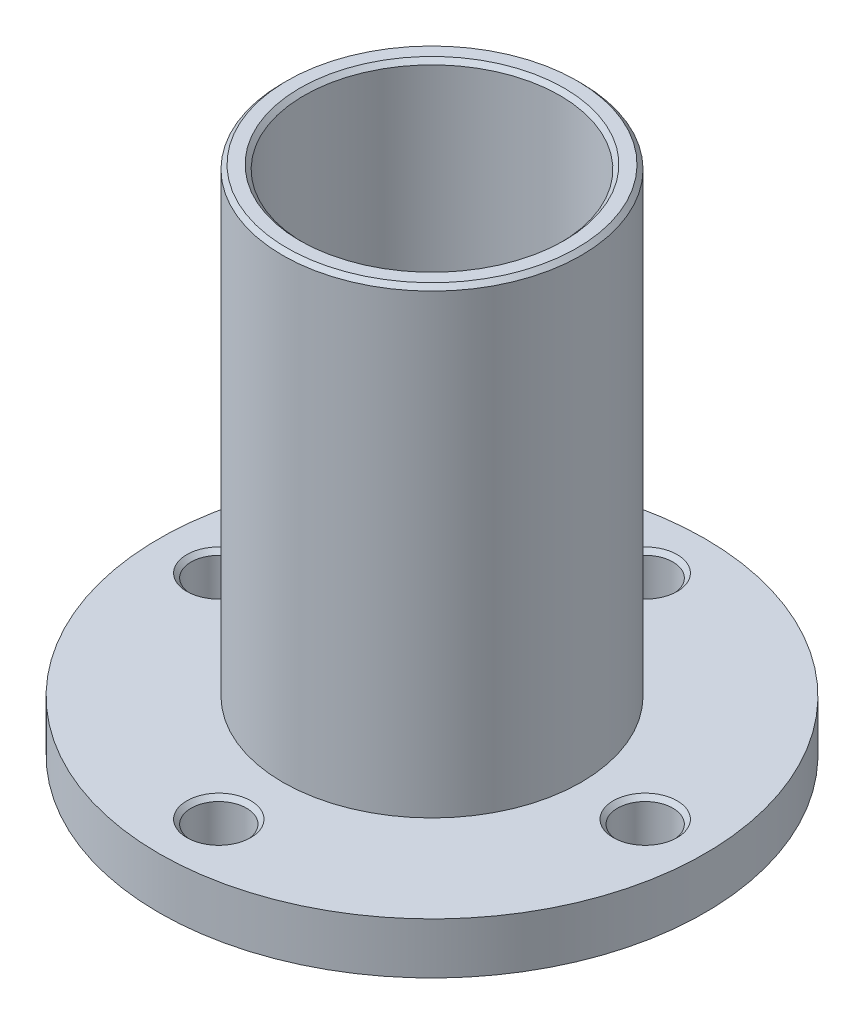
ISO-10303-21;
HEADER;
FILE_DESCRIPTION(('STEP AP214'),'2;1');
FILE_NAME('part.step','',(''),(''),'','','');
FILE_SCHEMA(('AUTOMOTIVE_DESIGN { 1 0 10303 214 1 1 1 1 }'));
ENDSEC;
DATA;
#1=APPLICATION_CONTEXT('core data for automotive mechanical design processes');
#2=APPLICATION_PROTOCOL_DEFINITION('international standard','automotive_design',2000,#1);
#3=PRODUCT_CONTEXT('',#1,'mechanical');
#4=PRODUCT('Part','Part','',(#3));
#5=PRODUCT_RELATED_PRODUCT_CATEGORY('part','',(#4));
#6=PRODUCT_DEFINITION_FORMATION('','',#4);
#7=PRODUCT_DEFINITION_CONTEXT('part definition',#1,'design');
#8=PRODUCT_DEFINITION('design','',#6,#7);
#9=PRODUCT_DEFINITION_SHAPE('','',#8);
#10=(LENGTH_UNIT() NAMED_UNIT(*) SI_UNIT(.MILLI.,.METRE.));
#11=(NAMED_UNIT(*) PLANE_ANGLE_UNIT() SI_UNIT($,.RADIAN.));
#12=(NAMED_UNIT(*) SI_UNIT($,.STERADIAN.) SOLID_ANGLE_UNIT());
#13=UNCERTAINTY_MEASURE_WITH_UNIT(LENGTH_MEASURE(1.E-05),#10,'distance_accuracy_value','');
#14=(GEOMETRIC_REPRESENTATION_CONTEXT(3) GLOBAL_UNCERTAINTY_ASSIGNED_CONTEXT((#13)) GLOBAL_UNIT_ASSIGNED_CONTEXT((#10,
#11,#12)) REPRESENTATION_CONTEXT('',''));
#15=CARTESIAN_POINT('',(0.,0.,0.));
#16=DIRECTION('',(0.,0.,1.));
#17=DIRECTION('',(1.,0.,0.));
#18=AXIS2_PLACEMENT_3D('',#15,#16,#17);
#19=CARTESIAN_POINT('',(-15.,60.,0.));
#20=DIRECTION('',(0.,-1.,0.));
#21=DIRECTION('',(0.,0.,-1.));
#22=AXIS2_PLACEMENT_3D('',#19,#20,#21);
#23=PLANE('',#22);
#24=CARTESIAN_POINT('',(0.,60.,0.));
#25=DIRECTION('',(0.,-1.,0.));
#26=DIRECTION('',(0.,0.,-1.));
#27=AXIS2_PLACEMENT_3D('',#24,#25,#26);
#28=CIRCLE('',#27,15.5);
#29=CARTESIAN_POINT('',(0.,60.,-15.5));
#30=VERTEX_POINT('',#29);
#31=EDGE_CURVE('E103',#30,#30,#28,.T.);
#32=ORIENTED_EDGE('',*,*,#31,.T.);
#33=EDGE_LOOP('',(#32));
#34=FACE_BOUND('',#33,.T.);
#35=CARTESIAN_POINT('',(0.,60.,0.));
#36=DIRECTION('',(0.,-1.,0.));
#37=DIRECTION('',(0.,0.,-1.));
#38=AXIS2_PLACEMENT_3D('',#35,#36,#37);
#39=CIRCLE('',#38,17.);
#40=CARTESIAN_POINT('',(0.,60.,-17.));
#41=VERTEX_POINT('',#40);
#42=EDGE_CURVE('E106',#41,#41,#39,.F.);
#43=ORIENTED_EDGE('',*,*,#42,.T.);
#44=EDGE_LOOP('',(#43));
#45=FACE_BOUND('',#44,.T.);
#46=ADVANCED_FACE('F34',(#34,#45),#23,.F.);
#47=CARTESIAN_POINT('',(0.,0.,0.));
#48=DIRECTION('',(0.,-1.,0.));
#49=DIRECTION('',(0.,0.,-1.));
#50=AXIS2_PLACEMENT_3D('',#47,#48,#49);
#51=CYLINDRICAL_SURFACE('',#50,17.5);
#52=CARTESIAN_POINT('',(0.,59.5,0.));
#53=DIRECTION('',(0.,-1.,0.));
#54=DIRECTION('',(0.,0.,-1.));
#55=AXIS2_PLACEMENT_3D('',#52,#53,#54);
#56=CIRCLE('',#55,17.5);
#57=CARTESIAN_POINT('',(0.,59.5,-17.5));
#58=VERTEX_POINT('',#57);
#59=EDGE_CURVE('E97',#58,#58,#56,.T.);
#60=ORIENTED_EDGE('',*,*,#59,.T.);
#61=EDGE_LOOP('',(#60));
#62=FACE_BOUND('',#61,.T.);
#63=CARTESIAN_POINT('',(0.,6.,0.));
#64=DIRECTION('',(0.,-1.,0.));
#65=DIRECTION('',(0.,0.,-1.));
#66=AXIS2_PLACEMENT_3D('',#63,#64,#65);
#67=CIRCLE('',#66,17.5);
#68=CARTESIAN_POINT('',(0.,6.,-17.5));
#69=VERTEX_POINT('',#68);
#70=EDGE_CURVE('E109',#69,#69,#67,.T.);
#71=ORIENTED_EDGE('',*,*,#70,.F.);
#72=EDGE_LOOP('',(#71));
#73=FACE_BOUND('',#72,.T.);
#74=ADVANCED_FACE('F149',(#62,#73),#51,.T.);
#75=CARTESIAN_POINT('',(-17.5,6.,0.));
#76=DIRECTION('',(0.,-1.,0.));
#77=DIRECTION('',(0.,0.,-1.));
#78=AXIS2_PLACEMENT_3D('',#75,#76,#77);
#79=PLANE('',#78);
#80=CARTESIAN_POINT('',(0.,6.,25.));
#81=DIRECTION('',(0.,-1.,0.));
#82=DIRECTION('',(0.,0.,-1.));
#83=AXIS2_PLACEMENT_3D('',#80,#81,#82);
#84=CIRCLE('',#83,3.75000000000006);
#85=CARTESIAN_POINT('',(0.,6.,21.2499999999999));
#86=VERTEX_POINT('',#85);
#87=EDGE_CURVE('E79',#86,#86,#84,.T.);
#88=ORIENTED_EDGE('',*,*,#87,.T.);
#89=EDGE_LOOP('',(#88));
#90=FACE_BOUND('',#89,.T.);
#91=CARTESIAN_POINT('',(-25.,6.,0.));
#92=DIRECTION('',(0.,-1.,0.));
#93=DIRECTION('',(0.,0.,-1.));
#94=AXIS2_PLACEMENT_3D('',#91,#92,#93);
#95=CIRCLE('',#94,3.75000000000004);
#96=CARTESIAN_POINT('',(-25.,6.,-3.75000000000004));
#97=VERTEX_POINT('',#96);
#98=EDGE_CURVE('E82',#97,#97,#95,.T.);
#99=ORIENTED_EDGE('',*,*,#98,.T.);
#100=EDGE_LOOP('',(#99));
#101=FACE_BOUND('',#100,.T.);
#102=CARTESIAN_POINT('',(25.,6.,0.));
#103=DIRECTION('',(0.,-1.,0.));
#104=DIRECTION('',(0.,0.,-1.));
#105=AXIS2_PLACEMENT_3D('',#102,#103,#104);
#106=CIRCLE('',#105,3.75000000000004);
#107=CARTESIAN_POINT('',(25.,6.,-3.75000000000005));
#108=VERTEX_POINT('',#107);
#109=EDGE_CURVE('E85',#108,#108,#106,.T.);
#110=ORIENTED_EDGE('',*,*,#109,.T.);
#111=EDGE_LOOP('',(#110));
#112=FACE_BOUND('',#111,.T.);
#113=CARTESIAN_POINT('',(0.,6.,-25.));
#114=DIRECTION('',(0.,-1.,0.));
#115=DIRECTION('',(0.,0.,-1.));
#116=AXIS2_PLACEMENT_3D('',#113,#114,#115);
#117=CIRCLE('',#116,3.75000000000004);
#118=CARTESIAN_POINT('',(0.,6.,-28.75));
#119=VERTEX_POINT('',#118);
#120=EDGE_CURVE('E88',#119,#119,#117,.T.);
#121=ORIENTED_EDGE('',*,*,#120,.T.);
#122=EDGE_LOOP('',(#121));
#123=FACE_BOUND('',#122,.T.);
#124=CARTESIAN_POINT('',(0.,6.,0.));
#125=DIRECTION('',(0.,-1.,0.));
#126=DIRECTION('',(0.,0.,-1.));
#127=AXIS2_PLACEMENT_3D('',#124,#125,#126);
#128=CIRCLE('',#127,32.);
#129=CARTESIAN_POINT('',(0.,6.,-32.));
#130=VERTEX_POINT('',#129);
#131=EDGE_CURVE('E112',#130,#130,#128,.T.);
#132=ORIENTED_EDGE('',*,*,#131,.F.);
#133=EDGE_LOOP('',(#132));
#134=FACE_BOUND('',#133,.T.);
#135=ORIENTED_EDGE('',*,*,#70,.T.);
#136=EDGE_LOOP('',(#135));
#137=FACE_BOUND('',#136,.T.);
#138=ADVANCED_FACE('F143',(#90,#101,#112,#123,#134,#137),#79,.F.);
#139=CARTESIAN_POINT('',(0.,0.,0.));
#140=DIRECTION('',(0.,-1.,0.));
#141=DIRECTION('',(0.,0.,-1.));
#142=AXIS2_PLACEMENT_3D('',#139,#140,#141);
#143=CYLINDRICAL_SURFACE('',#142,32.);
#144=CARTESIAN_POINT('',(0.,0.,0.));
#145=DIRECTION('',(0.,-1.,0.));
#146=DIRECTION('',(0.,0.,-1.));
#147=AXIS2_PLACEMENT_3D('',#144,#145,#146);
#148=CIRCLE('',#147,32.);
#149=CARTESIAN_POINT('',(0.,0.,-32.));
#150=VERTEX_POINT('',#149);
#151=EDGE_CURVE('E115',#150,#150,#148,.T.);
#152=ORIENTED_EDGE('',*,*,#151,.F.);
#153=EDGE_LOOP('',(#152));
#154=FACE_BOUND('',#153,.T.);
#155=ORIENTED_EDGE('',*,*,#131,.T.);
#156=EDGE_LOOP('',(#155));
#157=FACE_BOUND('',#156,.T.);
#158=ADVANCED_FACE('F136',(#154,#157),#143,.T.);
#159=CARTESIAN_POINT('',(-32.,0.,0.));
#160=DIRECTION('',(0.,1.,0.));
#161=DIRECTION('',(0.,0.,1.));
#162=AXIS2_PLACEMENT_3D('',#159,#160,#161);
#163=PLANE('',#162);
#164=CARTESIAN_POINT('',(0.,0.,25.));
#165=DIRECTION('',(0.,1.,0.));
#166=DIRECTION('',(0.,0.,1.));
#167=AXIS2_PLACEMENT_3D('',#164,#165,#166);
#168=CIRCLE('',#167,3.74999999999992);
#169=CARTESIAN_POINT('',(0.,0.,28.7499999999999));
#170=VERTEX_POINT('',#169);
#171=EDGE_CURVE('E46',#170,#170,#168,.T.);
#172=ORIENTED_EDGE('',*,*,#171,.T.);
#173=EDGE_LOOP('',(#172));
#174=FACE_BOUND('',#173,.T.);
#175=CARTESIAN_POINT('',(-25.,0.,0.));
#176=DIRECTION('',(0.,1.,0.));
#177=DIRECTION('',(0.,0.,1.));
#178=AXIS2_PLACEMENT_3D('',#175,#176,#177);
#179=CIRCLE('',#178,3.74999999999996);
#180=CARTESIAN_POINT('',(-25.,0.,3.74999999999997));
#181=VERTEX_POINT('',#180);
#182=EDGE_CURVE('E50',#181,#181,#179,.T.);
#183=ORIENTED_EDGE('',*,*,#182,.T.);
#184=EDGE_LOOP('',(#183));
#185=FACE_BOUND('',#184,.T.);
#186=CARTESIAN_POINT('',(0.,0.,-25.));
#187=DIRECTION('',(0.,1.,0.));
#188=DIRECTION('',(0.,0.,1.));
#189=AXIS2_PLACEMENT_3D('',#186,#187,#188);
#190=CIRCLE('',#189,3.74999999999995);
#191=CARTESIAN_POINT('',(0.,0.,-21.2500000000001));
#192=VERTEX_POINT('',#191);
#193=EDGE_CURVE('E55',#192,#192,#190,.T.);
#194=ORIENTED_EDGE('',*,*,#193,.T.);
#195=EDGE_LOOP('',(#194));
#196=FACE_BOUND('',#195,.T.);
#197=CARTESIAN_POINT('',(25.,0.,0.));
#198=DIRECTION('',(0.,1.,0.));
#199=DIRECTION('',(0.,0.,1.));
#200=AXIS2_PLACEMENT_3D('',#197,#198,#199);
#201=CIRCLE('',#200,3.74999999999996);
#202=CARTESIAN_POINT('',(25.,0.,3.74999999999995));
#203=VERTEX_POINT('',#202);
#204=EDGE_CURVE('E58',#203,#203,#201,.T.);
#205=ORIENTED_EDGE('',*,*,#204,.T.);
#206=EDGE_LOOP('',(#205));
#207=FACE_BOUND('',#206,.T.);
#208=CARTESIAN_POINT('',(0.,0.,0.));
#209=DIRECTION('',(0.,-1.,0.));
#210=DIRECTION('',(0.,0.,-1.));
#211=AXIS2_PLACEMENT_3D('',#208,#209,#210);
#212=CIRCLE('',#211,20.);
#213=CARTESIAN_POINT('',(0.,0.,-20.));
#214=VERTEX_POINT('',#213);
#215=EDGE_CURVE('E118',#214,#214,#212,.T.);
#216=ORIENTED_EDGE('',*,*,#215,.F.);
#217=EDGE_LOOP('',(#216));
#218=FACE_BOUND('',#217,.T.);
#219=ORIENTED_EDGE('',*,*,#151,.T.);
#220=EDGE_LOOP('',(#219));
#221=FACE_BOUND('',#220,.T.);
#222=ADVANCED_FACE('F130',(#174,#185,#196,#207,#218,#221),#163,.F.);
#223=CARTESIAN_POINT('',(0.,0.,0.));
#224=DIRECTION('',(0.,-1.,0.));
#225=DIRECTION('',(0.,0.,-1.));
#226=AXIS2_PLACEMENT_3D('',#223,#224,#225);
#227=CYLINDRICAL_SURFACE('',#226,20.);
#228=CARTESIAN_POINT('',(0.,2.3,0.));
#229=DIRECTION('',(0.,-1.,0.));
#230=DIRECTION('',(0.,0.,-1.));
#231=AXIS2_PLACEMENT_3D('',#228,#229,#230);
#232=CIRCLE('',#231,20.);
#233=CARTESIAN_POINT('',(0.,2.3,-20.));
#234=VERTEX_POINT('',#233);
#235=EDGE_CURVE('E121',#234,#234,#232,.T.);
#236=ORIENTED_EDGE('',*,*,#235,.F.);
#237=EDGE_LOOP('',(#236));
#238=FACE_BOUND('',#237,.T.);
#239=ORIENTED_EDGE('',*,*,#215,.T.);
#240=EDGE_LOOP('',(#239));
#241=FACE_BOUND('',#240,.T.);
#242=ADVANCED_FACE('F127',(#238,#241),#227,.F.);
#243=CARTESIAN_POINT('',(-15.,2.3,0.));
#244=DIRECTION('',(0.,1.,0.));
#245=DIRECTION('',(0.,0.,1.));
#246=AXIS2_PLACEMENT_3D('',#243,#244,#245);
#247=PLANE('',#246);
#248=CARTESIAN_POINT('',(0.,2.3,0.));
#249=DIRECTION('',(0.,1.,0.));
#250=DIRECTION('',(0.,0.,1.));
#251=AXIS2_PLACEMENT_3D('',#248,#249,#250);
#252=CIRCLE('',#251,15.5);
#253=CARTESIAN_POINT('',(0.,2.3,15.5));
#254=VERTEX_POINT('',#253);
#255=EDGE_CURVE('E10',#254,#254,#252,.T.);
#256=ORIENTED_EDGE('',*,*,#255,.T.);
#257=EDGE_LOOP('',(#256));
#258=FACE_BOUND('',#257,.T.);
#259=ORIENTED_EDGE('',*,*,#235,.T.);
#260=EDGE_LOOP('',(#259));
#261=FACE_BOUND('',#260,.T.);
#262=ADVANCED_FACE('F125',(#258,#261),#247,.F.);
#263=CARTESIAN_POINT('',(0.,0.,0.));
#264=DIRECTION('',(0.,-1.,0.));
#265=DIRECTION('',(0.,0.,-1.));
#266=AXIS2_PLACEMENT_3D('',#263,#264,#265);
#267=CYLINDRICAL_SURFACE('',#266,15.);
#268=CARTESIAN_POINT('',(0.,2.79999999999999,0.));
#269=DIRECTION('',(0.,1.,0.));
#270=DIRECTION('',(0.,0.,1.));
#271=AXIS2_PLACEMENT_3D('',#268,#269,#270);
#272=CIRCLE('',#271,15.);
#273=CARTESIAN_POINT('',(0.,2.79999999999999,15.));
#274=VERTEX_POINT('',#273);
#275=EDGE_CURVE('E42',#274,#274,#272,.F.);
#276=ORIENTED_EDGE('',*,*,#275,.T.);
#277=EDGE_LOOP('',(#276));
#278=FACE_BOUND('',#277,.T.);
#279=CARTESIAN_POINT('',(0.,59.5,0.));
#280=DIRECTION('',(0.,-1.,0.));
#281=DIRECTION('',(0.,0.,-1.));
#282=AXIS2_PLACEMENT_3D('',#279,#280,#281);
#283=CIRCLE('',#282,15.);
#284=CARTESIAN_POINT('',(0.,59.5,-15.));
#285=VERTEX_POINT('',#284);
#286=EDGE_CURVE('E100',#285,#285,#283,.F.);
#287=ORIENTED_EDGE('',*,*,#286,.T.);
#288=EDGE_LOOP('',(#287));
#289=FACE_BOUND('',#288,.T.);
#290=ADVANCED_FACE('F171',(#278,#289),#267,.F.);
#291=CARTESIAN_POINT('',(0.,60.,0.));
#292=DIRECTION('',(0.,1.,0.));
#293=DIRECTION('',(0.,0.,1.));
#294=AXIS2_PLACEMENT_3D('',#291,#292,#293);
#295=CONICAL_SURFACE('',#294,15.5,0.78539816339745);
#296=ORIENTED_EDGE('',*,*,#286,.F.);
#297=EDGE_LOOP('',(#296));
#298=FACE_BOUND('',#297,.T.);
#299=ORIENTED_EDGE('',*,*,#31,.F.);
#300=EDGE_LOOP('',(#299));
#301=FACE_BOUND('',#300,.T.);
#302=ADVANCED_FACE('F164',(#298,#301),#295,.F.);
#303=CARTESIAN_POINT('',(0.,59.5,0.));
#304=DIRECTION('',(0.,-1.,0.));
#305=DIRECTION('',(0.,0.,-1.));
#306=AXIS2_PLACEMENT_3D('',#303,#304,#305);
#307=CONICAL_SURFACE('',#306,17.5,0.785398163397452);
#308=ORIENTED_EDGE('',*,*,#42,.F.);
#309=EDGE_LOOP('',(#308));
#310=FACE_BOUND('',#309,.T.);
#311=ORIENTED_EDGE('',*,*,#59,.F.);
#312=EDGE_LOOP('',(#311));
#313=FACE_BOUND('',#312,.T.);
#314=ADVANCED_FACE('F170',(#310,#313),#307,.T.);
#315=CARTESIAN_POINT('',(-25.,0.,0.));
#316=DIRECTION('',(0.,1.,0.));
#317=DIRECTION('',(0.,0.,1.));
#318=AXIS2_PLACEMENT_3D('',#315,#316,#317);
#319=CYLINDRICAL_SURFACE('',#318,3.25);
#320=CARTESIAN_POINT('',(-25.,5.49999999999996,0.));
#321=DIRECTION('',(0.,-1.,0.));
#322=DIRECTION('',(0.,0.,-1.));
#323=AXIS2_PLACEMENT_3D('',#320,#321,#322);
#324=CIRCLE('',#323,3.25);
#325=CARTESIAN_POINT('',(-25.,5.49999999999996,3.25000000000001));
#326=VERTEX_POINT('',#325);
#327=EDGE_CURVE('E73',#326,#326,#324,.F.);
#328=CARTESIAN_POINT('',(-25.,0.499999999999964,0.));
#329=DIRECTION('',(0.,1.,0.));
#330=DIRECTION('',(0.,0.,1.));
#331=AXIS2_PLACEMENT_3D('',#328,#329,#330);
#332=CIRCLE('',#331,3.25);
#333=CARTESIAN_POINT('',(-25.,0.499999999999963,3.25000000000001));
#334=VERTEX_POINT('',#333);
#335=EDGE_CURVE('E76',#334,#334,#332,.F.);
#336=CARTESIAN_POINT('',(-25.,5.49999999999996,3.25000000000001));
#337=CARTESIAN_POINT('',(-25.,5.44791666666663,3.25000000000001));
#338=CARTESIAN_POINT('',(-25.,5.39583333333329,3.25000000000001));
#339=CARTESIAN_POINT('',(-25.,5.29166666666663,3.25000000000001));
#340=CARTESIAN_POINT('',(-25.,5.23958333333329,3.25000000000001));
#341=CARTESIAN_POINT('',(-25.,5.13541666666663,3.25000000000001));
#342=CARTESIAN_POINT('',(-25.,5.08333333333329,3.25000000000001));
#343=CARTESIAN_POINT('',(-25.,4.97916666666663,3.25000000000001));
#344=CARTESIAN_POINT('',(-25.,4.92708333333329,3.25000000000001));
#345=CARTESIAN_POINT('',(-25.,4.82291666666663,3.25000000000001));
#346=CARTESIAN_POINT('',(-25.,4.77083333333329,3.25000000000001));
#347=CARTESIAN_POINT('',(-25.,4.66666666666663,3.25000000000001));
#348=CARTESIAN_POINT('',(-25.,4.61458333333329,3.25000000000001));
#349=CARTESIAN_POINT('',(-25.,4.51041666666663,3.25000000000001));
#350=CARTESIAN_POINT('',(-25.,4.45833333333329,3.25000000000001));
#351=CARTESIAN_POINT('',(-25.,4.35416666666663,3.25000000000001));
#352=CARTESIAN_POINT('',(-25.,4.30208333333329,3.25000000000001));
#353=CARTESIAN_POINT('',(-25.,4.19791666666663,3.25000000000001));
#354=CARTESIAN_POINT('',(-25.,4.14583333333329,3.25000000000001));
#355=CARTESIAN_POINT('',(-25.,4.04166666666663,3.25000000000001));
#356=CARTESIAN_POINT('',(-25.,3.98958333333329,3.25000000000001));
#357=CARTESIAN_POINT('',(-25.,3.88541666666663,3.25000000000001));
#358=CARTESIAN_POINT('',(-25.,3.83333333333329,3.25000000000001));
#359=CARTESIAN_POINT('',(-25.,3.72916666666663,3.25000000000001));
#360=CARTESIAN_POINT('',(-25.,3.6770833333333,3.25000000000001));
#361=CARTESIAN_POINT('',(-25.,3.57291666666663,3.25000000000001));
#362=CARTESIAN_POINT('',(-25.,3.5208333333333,3.25000000000001));
#363=CARTESIAN_POINT('',(-25.,3.41666666666663,3.25000000000001));
#364=CARTESIAN_POINT('',(-25.,3.3645833333333,3.25000000000001));
#365=CARTESIAN_POINT('',(-25.,3.26041666666663,3.25000000000001));
#366=CARTESIAN_POINT('',(-25.,3.2083333333333,3.25000000000001));
#367=CARTESIAN_POINT('',(-25.,3.10416666666663,3.25000000000001));
#368=CARTESIAN_POINT('',(-25.,3.0520833333333,3.25000000000001));
#369=CARTESIAN_POINT('',(-25.,2.94791666666663,3.25000000000001));
#370=CARTESIAN_POINT('',(-25.,2.8958333333333,3.25000000000001));
#371=CARTESIAN_POINT('',(-25.,2.79166666666663,3.25000000000001));
#372=CARTESIAN_POINT('',(-25.,2.7395833333333,3.25000000000001));
#373=CARTESIAN_POINT('',(-25.,2.63541666666663,3.25000000000001));
#374=CARTESIAN_POINT('',(-25.,2.5833333333333,3.25000000000001));
#375=CARTESIAN_POINT('',(-25.,2.47916666666663,3.25000000000001));
#376=CARTESIAN_POINT('',(-25.,2.4270833333333,3.25000000000001));
#377=CARTESIAN_POINT('',(-25.,2.32291666666663,3.25000000000001));
#378=CARTESIAN_POINT('',(-25.,2.2708333333333,3.25000000000001));
#379=CARTESIAN_POINT('',(-25.,2.16666666666663,3.25000000000001));
#380=CARTESIAN_POINT('',(-25.,2.1145833333333,3.25000000000001));
#381=CARTESIAN_POINT('',(-25.,2.01041666666663,3.25000000000001));
#382=CARTESIAN_POINT('',(-25.,1.9583333333333,3.25000000000001));
#383=CARTESIAN_POINT('',(-25.,1.85416666666663,3.25000000000001));
#384=CARTESIAN_POINT('',(-25.,1.8020833333333,3.25000000000001));
#385=CARTESIAN_POINT('',(-25.,1.69791666666663,3.25000000000001));
#386=CARTESIAN_POINT('',(-25.,1.6458333333333,3.25000000000001));
#387=CARTESIAN_POINT('',(-25.,1.54166666666663,3.25000000000001));
#388=CARTESIAN_POINT('',(-25.,1.4895833333333,3.25000000000001));
#389=CARTESIAN_POINT('',(-25.,1.38541666666663,3.25000000000001));
#390=CARTESIAN_POINT('',(-25.,1.3333333333333,3.25000000000001));
#391=CARTESIAN_POINT('',(-25.,1.22916666666663,3.25000000000001));
#392=CARTESIAN_POINT('',(-25.,1.1770833333333,3.25000000000001));
#393=CARTESIAN_POINT('',(-25.,1.07291666666663,3.25000000000001));
#394=CARTESIAN_POINT('',(-25.,1.0208333333333,3.25000000000001));
#395=CARTESIAN_POINT('',(-25.,0.91666666666663,3.25000000000001));
#396=CARTESIAN_POINT('',(-25.,0.864583333333297,3.25000000000001));
#397=CARTESIAN_POINT('',(-25.,0.760416666666631,3.25000000000001));
#398=CARTESIAN_POINT('',(-25.,0.708333333333297,3.25000000000001));
#399=CARTESIAN_POINT('',(-25.,0.604166666666631,3.25000000000001));
#400=CARTESIAN_POINT('',(-25.,0.552083333333297,3.25000000000001));
#401=CARTESIAN_POINT('',(-25.,0.499999999999964,3.25000000000001));
#402=B_SPLINE_CURVE_WITH_KNOTS('',3,(#336,#337,#338,#339,#340,#341,#342,#343,#344,#345,#346,
#347,#348,#349,#350,#351,#352,#353,#354,#355,#356,#357,#358,#359,#360,#361,#362,#363,#364,#365,
#366,#367,#368,#369,#370,#371,#372,#373,#374,#375,#376,#377,#378,#379,#380,#381,#382,#383,#384,
#385,#386,#387,#388,#389,#390,#391,#392,#393,#394,#395,#396,#397,#398,#399,#400,#401),
.UNSPECIFIED.,.F.,.F.,(4,2,2,2,2,2,2,2,2,2,2,2,2,2,2,2,2,2,2,2,2,2,2,2,2,2,2,2,2,2,2,2,4),(0.,
0.15625,0.3125,0.46875,0.625,0.78125,0.937499999999999,1.09375,1.25,1.40625,1.5625,1.71875,
1.875,2.03125,2.1875,2.34375,2.5,2.65625,2.8125,2.96875,3.125,3.28125,3.4375,3.59375,3.75,
3.90625,4.0625,4.21875,4.375,4.53125,4.6875,4.84375,5.),.UNSPECIFIED.);
#403=EDGE_CURVE('BSEAM178',#326,#334,#402,.T.);
#404=ORIENTED_EDGE('',*,*,#327,.T.);
#405=ORIENTED_EDGE('',*,*,#335,.T.);
#406=ORIENTED_EDGE('',*,*,#403,.T.);
#407=ORIENTED_EDGE('',*,*,#403,.F.);
#408=EDGE_LOOP('',(#404,#406,#405,#407));
#409=FACE_BOUND('',#408,.T.);
#410=ADVANCED_FACE('F178',(#409),#319,.F.);
#411=CARTESIAN_POINT('',(0.,0.,25.));
#412=DIRECTION('',(0.,1.,0.));
#413=DIRECTION('',(0.,0.,1.));
#414=AXIS2_PLACEMENT_3D('',#411,#412,#413);
#415=CYLINDRICAL_SURFACE('',#414,3.25);
#416=CARTESIAN_POINT('',(0.,5.49999999999995,25.));
#417=DIRECTION('',(0.,-1.,0.));
#418=DIRECTION('',(0.,0.,-1.));
#419=AXIS2_PLACEMENT_3D('',#416,#417,#418);
#420=CIRCLE('',#419,3.25);
#421=CARTESIAN_POINT('',(0.,5.49999999999995,28.25));
#422=VERTEX_POINT('',#421);
#423=EDGE_CURVE('E91',#422,#422,#420,.F.);
#424=CARTESIAN_POINT('',(0.,0.499999999999927,25.));
#425=DIRECTION('',(0.,1.,0.));
#426=DIRECTION('',(0.,0.,1.));
#427=AXIS2_PLACEMENT_3D('',#424,#425,#426);
#428=CIRCLE('',#427,3.25);
#429=CARTESIAN_POINT('',(0.,0.499999999999927,28.25));
#430=VERTEX_POINT('',#429);
#431=EDGE_CURVE('E94',#430,#430,#428,.F.);
#432=CARTESIAN_POINT('',(0.,5.49999999999995,28.25));
#433=CARTESIAN_POINT('',(0.,5.44791666666661,28.25));
#434=CARTESIAN_POINT('',(0.,5.39583333333328,28.25));
#435=CARTESIAN_POINT('',(0.,5.29166666666661,28.25));
#436=CARTESIAN_POINT('',(0.,5.23958333333328,28.25));
#437=CARTESIAN_POINT('',(0.,5.13541666666661,28.25));
#438=CARTESIAN_POINT('',(0.,5.08333333333328,28.25));
#439=CARTESIAN_POINT('',(0.,4.97916666666661,28.25));
#440=CARTESIAN_POINT('',(0.,4.92708333333328,28.25));
#441=CARTESIAN_POINT('',(0.,4.82291666666661,28.25));
#442=CARTESIAN_POINT('',(0.,4.77083333333328,28.25));
#443=CARTESIAN_POINT('',(0.,4.66666666666661,28.25));
#444=CARTESIAN_POINT('',(0.,4.61458333333328,28.25));
#445=CARTESIAN_POINT('',(0.,4.51041666666661,28.25));
#446=CARTESIAN_POINT('',(0.,4.45833333333328,28.25));
#447=CARTESIAN_POINT('',(0.,4.35416666666661,28.25));
#448=CARTESIAN_POINT('',(0.,4.30208333333328,28.25));
#449=CARTESIAN_POINT('',(0.,4.19791666666661,28.25));
#450=CARTESIAN_POINT('',(0.,4.14583333333327,28.25));
#451=CARTESIAN_POINT('',(0.,4.04166666666661,28.25));
#452=CARTESIAN_POINT('',(0.,3.98958333333327,28.25));
#453=CARTESIAN_POINT('',(0.,3.88541666666661,28.25));
#454=CARTESIAN_POINT('',(0.,3.83333333333327,28.25));
#455=CARTESIAN_POINT('',(0.,3.72916666666661,28.25));
#456=CARTESIAN_POINT('',(0.,3.67708333333327,28.25));
#457=CARTESIAN_POINT('',(0.,3.57291666666661,28.25));
#458=CARTESIAN_POINT('',(0.,3.52083333333327,28.25));
#459=CARTESIAN_POINT('',(0.,3.41666666666661,28.25));
#460=CARTESIAN_POINT('',(0.,3.36458333333327,28.25));
#461=CARTESIAN_POINT('',(0.,3.2604166666666,28.25));
#462=CARTESIAN_POINT('',(0.,3.20833333333327,28.25));
#463=CARTESIAN_POINT('',(0.,3.1041666666666,28.25));
#464=CARTESIAN_POINT('',(0.,3.05208333333327,28.25));
#465=CARTESIAN_POINT('',(0.,2.9479166666666,28.25));
#466=CARTESIAN_POINT('',(0.,2.89583333333327,28.25));
#467=CARTESIAN_POINT('',(0.,2.7916666666666,28.25));
#468=CARTESIAN_POINT('',(0.,2.73958333333327,28.25));
#469=CARTESIAN_POINT('',(0.,2.6354166666666,28.25));
#470=CARTESIAN_POINT('',(0.,2.58333333333327,28.25));
#471=CARTESIAN_POINT('',(0.,2.4791666666666,28.25));
#472=CARTESIAN_POINT('',(0.,2.42708333333327,28.25));
#473=CARTESIAN_POINT('',(0.,2.3229166666666,28.25));
#474=CARTESIAN_POINT('',(0.,2.27083333333327,28.25));
#475=CARTESIAN_POINT('',(0.,2.1666666666666,28.25));
#476=CARTESIAN_POINT('',(0.,2.11458333333327,28.25));
#477=CARTESIAN_POINT('',(0.,2.0104166666666,28.25));
#478=CARTESIAN_POINT('',(0.,1.95833333333327,28.25));
#479=CARTESIAN_POINT('',(0.,1.8541666666666,28.25));
#480=CARTESIAN_POINT('',(0.,1.80208333333327,28.25));
#481=CARTESIAN_POINT('',(0.,1.6979166666666,28.25));
#482=CARTESIAN_POINT('',(0.,1.64583333333327,28.25));
#483=CARTESIAN_POINT('',(0.,1.5416666666666,28.25));
#484=CARTESIAN_POINT('',(0.,1.48958333333326,28.25));
#485=CARTESIAN_POINT('',(0.,1.3854166666666,28.25));
#486=CARTESIAN_POINT('',(0.,1.33333333333326,28.25));
#487=CARTESIAN_POINT('',(0.,1.2291666666666,28.25));
#488=CARTESIAN_POINT('',(0.,1.17708333333326,28.25));
#489=CARTESIAN_POINT('',(0.,1.0729166666666,28.25));
#490=CARTESIAN_POINT('',(0.,1.02083333333326,28.25));
#491=CARTESIAN_POINT('',(0.,0.916666666666596,28.25));
#492=CARTESIAN_POINT('',(0.,0.864583333333262,28.25));
#493=CARTESIAN_POINT('',(0.,0.760416666666595,28.25));
#494=CARTESIAN_POINT('',(0.,0.708333333333262,28.25));
#495=CARTESIAN_POINT('',(0.,0.604166666666595,28.25));
#496=CARTESIAN_POINT('',(0.,0.552083333333261,28.25));
#497=CARTESIAN_POINT('',(0.,0.499999999999928,28.25));
#498=B_SPLINE_CURVE_WITH_KNOTS('',3,(#432,#433,#434,#435,#436,#437,#438,#439,#440,#441,#442,
#443,#444,#445,#446,#447,#448,#449,#450,#451,#452,#453,#454,#455,#456,#457,#458,#459,#460,#461,
#462,#463,#464,#465,#466,#467,#468,#469,#470,#471,#472,#473,#474,#475,#476,#477,#478,#479,#480,
#481,#482,#483,#484,#485,#486,#487,#488,#489,#490,#491,#492,#493,#494,#495,#496,#497),
.UNSPECIFIED.,.F.,.F.,(4,2,2,2,2,2,2,2,2,2,2,2,2,2,2,2,2,2,2,2,2,2,2,2,2,2,2,2,2,2,2,2,4),(0.,
0.156250000000001,0.312500000000001,0.468750000000002,0.625000000000002,0.781250000000003,
0.937500000000003,1.09375,1.25,1.40625000000001,1.56250000000001,1.71875000000001,
1.87500000000001,2.03125000000001,2.18750000000001,2.34375000000001,2.50000000000001,
2.65625000000001,2.81250000000001,2.96875000000001,3.12500000000001,3.28125000000001,
3.43750000000001,3.59375000000001,3.75000000000001,3.90625000000001,4.06250000000002,
4.21875000000002,4.37500000000002,4.53125000000002,4.68750000000002,4.84375000000002,
5.00000000000002),.UNSPECIFIED.);
#499=EDGE_CURVE('BSEAM245',#422,#430,#498,.T.);
#500=ORIENTED_EDGE('',*,*,#423,.T.);
#501=ORIENTED_EDGE('',*,*,#431,.T.);
#502=ORIENTED_EDGE('',*,*,#499,.T.);
#503=ORIENTED_EDGE('',*,*,#499,.F.);
#504=EDGE_LOOP('',(#500,#502,#501,#503));
#505=FACE_BOUND('',#504,.T.);
#506=ADVANCED_FACE('F245',(#505),#415,.F.);
#507=CARTESIAN_POINT('',(25.,0.,0.));
#508=DIRECTION('',(0.,1.,0.));
#509=DIRECTION('',(0.,0.,1.));
#510=AXIS2_PLACEMENT_3D('',#507,#508,#509);
#511=CYLINDRICAL_SURFACE('',#510,3.25);
#512=CARTESIAN_POINT('',(25.,5.49999999999996,0.));
#513=DIRECTION('',(0.,-1.,0.));
#514=DIRECTION('',(0.,0.,-1.));
#515=AXIS2_PLACEMENT_3D('',#512,#513,#514);
#516=CIRCLE('',#515,3.25);
#517=CARTESIAN_POINT('',(25.,5.49999999999996,3.24999999999999));
#518=VERTEX_POINT('',#517);
#519=EDGE_CURVE('E67',#518,#518,#516,.F.);
#520=CARTESIAN_POINT('',(25.,0.499999999999964,0.));
#521=DIRECTION('',(0.,1.,0.));
#522=DIRECTION('',(0.,0.,1.));
#523=AXIS2_PLACEMENT_3D('',#520,#521,#522);
#524=CIRCLE('',#523,3.25);
#525=CARTESIAN_POINT('',(25.,0.499999999999963,3.24999999999999));
#526=VERTEX_POINT('',#525);
#527=EDGE_CURVE('E70',#526,#526,#524,.F.);
#528=CARTESIAN_POINT('',(25.,5.49999999999996,3.24999999999999));
#529=CARTESIAN_POINT('',(25.,5.44791666666663,3.24999999999999));
#530=CARTESIAN_POINT('',(25.,5.39583333333329,3.24999999999999));
#531=CARTESIAN_POINT('',(25.,5.29166666666663,3.24999999999999));
#532=CARTESIAN_POINT('',(25.,5.23958333333329,3.24999999999999));
#533=CARTESIAN_POINT('',(25.,5.13541666666663,3.24999999999999));
#534=CARTESIAN_POINT('',(25.,5.08333333333329,3.24999999999999));
#535=CARTESIAN_POINT('',(25.,4.97916666666663,3.24999999999999));
#536=CARTESIAN_POINT('',(25.,4.92708333333329,3.24999999999999));
#537=CARTESIAN_POINT('',(25.,4.82291666666663,3.24999999999999));
#538=CARTESIAN_POINT('',(25.,4.77083333333329,3.24999999999999));
#539=CARTESIAN_POINT('',(25.,4.66666666666663,3.24999999999999));
#540=CARTESIAN_POINT('',(25.,4.61458333333329,3.24999999999999));
#541=CARTESIAN_POINT('',(25.,4.51041666666663,3.24999999999999));
#542=CARTESIAN_POINT('',(25.,4.45833333333329,3.24999999999999));
#543=CARTESIAN_POINT('',(25.,4.35416666666663,3.24999999999999));
#544=CARTESIAN_POINT('',(25.,4.30208333333329,3.24999999999999));
#545=CARTESIAN_POINT('',(25.,4.19791666666663,3.24999999999999));
#546=CARTESIAN_POINT('',(25.,4.14583333333329,3.24999999999999));
#547=CARTESIAN_POINT('',(25.,4.04166666666663,3.24999999999999));
#548=CARTESIAN_POINT('',(25.,3.98958333333329,3.24999999999999));
#549=CARTESIAN_POINT('',(25.,3.88541666666663,3.24999999999999));
#550=CARTESIAN_POINT('',(25.,3.83333333333329,3.24999999999999));
#551=CARTESIAN_POINT('',(25.,3.72916666666663,3.24999999999999));
#552=CARTESIAN_POINT('',(25.,3.6770833333333,3.24999999999999));
#553=CARTESIAN_POINT('',(25.,3.57291666666663,3.24999999999999));
#554=CARTESIAN_POINT('',(25.,3.5208333333333,3.24999999999999));
#555=CARTESIAN_POINT('',(25.,3.41666666666663,3.24999999999999));
#556=CARTESIAN_POINT('',(25.,3.3645833333333,3.24999999999999));
#557=CARTESIAN_POINT('',(25.,3.26041666666663,3.24999999999999));
#558=CARTESIAN_POINT('',(25.,3.2083333333333,3.24999999999999));
#559=CARTESIAN_POINT('',(25.,3.10416666666663,3.24999999999999));
#560=CARTESIAN_POINT('',(25.,3.0520833333333,3.24999999999999));
#561=CARTESIAN_POINT('',(25.,2.94791666666663,3.24999999999999));
#562=CARTESIAN_POINT('',(25.,2.8958333333333,3.24999999999999));
#563=CARTESIAN_POINT('',(25.,2.79166666666663,3.24999999999999));
#564=CARTESIAN_POINT('',(25.,2.7395833333333,3.24999999999999));
#565=CARTESIAN_POINT('',(25.,2.63541666666663,3.24999999999999));
#566=CARTESIAN_POINT('',(25.,2.5833333333333,3.24999999999999));
#567=CARTESIAN_POINT('',(25.,2.47916666666663,3.24999999999999));
#568=CARTESIAN_POINT('',(25.,2.4270833333333,3.24999999999999));
#569=CARTESIAN_POINT('',(25.,2.32291666666663,3.24999999999999));
#570=CARTESIAN_POINT('',(25.,2.2708333333333,3.24999999999999));
#571=CARTESIAN_POINT('',(25.,2.16666666666663,3.24999999999999));
#572=CARTESIAN_POINT('',(25.,2.1145833333333,3.24999999999999));
#573=CARTESIAN_POINT('',(25.,2.01041666666663,3.24999999999999));
#574=CARTESIAN_POINT('',(25.,1.9583333333333,3.24999999999999));
#575=CARTESIAN_POINT('',(25.,1.85416666666663,3.24999999999999));
#576=CARTESIAN_POINT('',(25.,1.8020833333333,3.24999999999999));
#577=CARTESIAN_POINT('',(25.,1.69791666666663,3.24999999999999));
#578=CARTESIAN_POINT('',(25.,1.6458333333333,3.24999999999999));
#579=CARTESIAN_POINT('',(25.,1.54166666666663,3.24999999999999));
#580=CARTESIAN_POINT('',(25.,1.4895833333333,3.24999999999999));
#581=CARTESIAN_POINT('',(25.,1.38541666666663,3.24999999999999));
#582=CARTESIAN_POINT('',(25.,1.3333333333333,3.24999999999999));
#583=CARTESIAN_POINT('',(25.,1.22916666666663,3.24999999999999));
#584=CARTESIAN_POINT('',(25.,1.1770833333333,3.24999999999999));
#585=CARTESIAN_POINT('',(25.,1.07291666666663,3.24999999999999));
#586=CARTESIAN_POINT('',(25.,1.0208333333333,3.24999999999999));
#587=CARTESIAN_POINT('',(25.,0.91666666666663,3.24999999999999));
#588=CARTESIAN_POINT('',(25.,0.864583333333297,3.24999999999999));
#589=CARTESIAN_POINT('',(25.,0.760416666666631,3.24999999999999));
#590=CARTESIAN_POINT('',(25.,0.708333333333297,3.24999999999999));
#591=CARTESIAN_POINT('',(25.,0.604166666666631,3.24999999999999));
#592=CARTESIAN_POINT('',(25.,0.552083333333297,3.24999999999999));
#593=CARTESIAN_POINT('',(25.,0.499999999999964,3.24999999999999));
#594=B_SPLINE_CURVE_WITH_KNOTS('',3,(#528,#529,#530,#531,#532,#533,#534,#535,#536,#537,#538,
#539,#540,#541,#542,#543,#544,#545,#546,#547,#548,#549,#550,#551,#552,#553,#554,#555,#556,#557,
#558,#559,#560,#561,#562,#563,#564,#565,#566,#567,#568,#569,#570,#571,#572,#573,#574,#575,#576,
#577,#578,#579,#580,#581,#582,#583,#584,#585,#586,#587,#588,#589,#590,#591,#592,#593),
.UNSPECIFIED.,.F.,.F.,(4,2,2,2,2,2,2,2,2,2,2,2,2,2,2,2,2,2,2,2,2,2,2,2,2,2,2,2,2,2,2,2,4),(0.,
0.15625,0.3125,0.46875,0.625,0.78125,0.937499999999999,1.09375,1.25,1.40625,1.5625,1.71875,
1.875,2.03125,2.1875,2.34375,2.5,2.65625,2.8125,2.96875,3.125,3.28125,3.4375,3.59375,3.75,
3.90625,4.0625,4.21875,4.375,4.53125,4.6875,4.84375,5.),.UNSPECIFIED.);
#595=EDGE_CURVE('BSEAM243',#518,#526,#594,.T.);
#596=ORIENTED_EDGE('',*,*,#519,.T.);
#597=ORIENTED_EDGE('',*,*,#527,.T.);
#598=ORIENTED_EDGE('',*,*,#595,.T.);
#599=ORIENTED_EDGE('',*,*,#595,.F.);
#600=EDGE_LOOP('',(#596,#598,#597,#599));
#601=FACE_BOUND('',#600,.T.);
#602=ADVANCED_FACE('F243',(#601),#511,.F.);
#603=CARTESIAN_POINT('',(0.,0.,-25.));
#604=DIRECTION('',(0.,1.,0.));
#605=DIRECTION('',(0.,0.,1.));
#606=AXIS2_PLACEMENT_3D('',#603,#604,#605);
#607=CYLINDRICAL_SURFACE('',#606,3.25);
#608=CARTESIAN_POINT('',(0.,5.49999999999994,-25.));
#609=DIRECTION('',(0.,-1.,0.));
#610=DIRECTION('',(0.,0.,-1.));
#611=AXIS2_PLACEMENT_3D('',#608,#609,#610);
#612=CIRCLE('',#611,3.25);
#613=CARTESIAN_POINT('',(0.,5.49999999999994,-21.75));
#614=VERTEX_POINT('',#613);
#615=EDGE_CURVE('E61',#614,#614,#612,.F.);
#616=CARTESIAN_POINT('',(0.,0.499999999999941,-25.));
#617=DIRECTION('',(0.,1.,0.));
#618=DIRECTION('',(0.,0.,1.));
#619=AXIS2_PLACEMENT_3D('',#616,#617,#618);
#620=CIRCLE('',#619,3.25);
#621=CARTESIAN_POINT('',(0.,0.499999999999941,-21.75));
#622=VERTEX_POINT('',#621);
#623=EDGE_CURVE('E64',#622,#622,#620,.F.);
#624=CARTESIAN_POINT('',(0.,5.49999999999994,-21.75));
#625=CARTESIAN_POINT('',(0.,5.44791666666661,-21.75));
#626=CARTESIAN_POINT('',(0.,5.39583333333328,-21.75));
#627=CARTESIAN_POINT('',(0.,5.29166666666661,-21.75));
#628=CARTESIAN_POINT('',(0.,5.23958333333328,-21.75));
#629=CARTESIAN_POINT('',(0.,5.13541666666661,-21.75));
#630=CARTESIAN_POINT('',(0.,5.08333333333328,-21.75));
#631=CARTESIAN_POINT('',(0.,4.97916666666661,-21.75));
#632=CARTESIAN_POINT('',(0.,4.92708333333328,-21.75));
#633=CARTESIAN_POINT('',(0.,4.82291666666661,-21.75));
#634=CARTESIAN_POINT('',(0.,4.77083333333328,-21.75));
#635=CARTESIAN_POINT('',(0.,4.66666666666661,-21.75));
#636=CARTESIAN_POINT('',(0.,4.61458333333328,-21.75));
#637=CARTESIAN_POINT('',(0.,4.51041666666661,-21.75));
#638=CARTESIAN_POINT('',(0.,4.45833333333328,-21.75));
#639=CARTESIAN_POINT('',(0.,4.35416666666661,-21.75));
#640=CARTESIAN_POINT('',(0.,4.30208333333328,-21.75));
#641=CARTESIAN_POINT('',(0.,4.19791666666661,-21.75));
#642=CARTESIAN_POINT('',(0.,4.14583333333328,-21.75));
#643=CARTESIAN_POINT('',(0.,4.04166666666661,-21.75));
#644=CARTESIAN_POINT('',(0.,3.98958333333328,-21.75));
#645=CARTESIAN_POINT('',(0.,3.88541666666661,-21.75));
#646=CARTESIAN_POINT('',(0.,3.83333333333328,-21.75));
#647=CARTESIAN_POINT('',(0.,3.72916666666661,-21.75));
#648=CARTESIAN_POINT('',(0.,3.67708333333328,-21.75));
#649=CARTESIAN_POINT('',(0.,3.57291666666661,-21.75));
#650=CARTESIAN_POINT('',(0.,3.52083333333328,-21.75));
#651=CARTESIAN_POINT('',(0.,3.41666666666661,-21.75));
#652=CARTESIAN_POINT('',(0.,3.36458333333328,-21.75));
#653=CARTESIAN_POINT('',(0.,3.26041666666661,-21.75));
#654=CARTESIAN_POINT('',(0.,3.20833333333328,-21.75));
#655=CARTESIAN_POINT('',(0.,3.10416666666661,-21.75));
#656=CARTESIAN_POINT('',(0.,3.05208333333328,-21.75));
#657=CARTESIAN_POINT('',(0.,2.94791666666661,-21.75));
#658=CARTESIAN_POINT('',(0.,2.89583333333328,-21.75));
#659=CARTESIAN_POINT('',(0.,2.79166666666661,-21.75));
#660=CARTESIAN_POINT('',(0.,2.73958333333328,-21.75));
#661=CARTESIAN_POINT('',(0.,2.63541666666661,-21.75));
#662=CARTESIAN_POINT('',(0.,2.58333333333328,-21.75));
#663=CARTESIAN_POINT('',(0.,2.47916666666661,-21.75));
#664=CARTESIAN_POINT('',(0.,2.42708333333328,-21.75));
#665=CARTESIAN_POINT('',(0.,2.32291666666661,-21.75));
#666=CARTESIAN_POINT('',(0.,2.27083333333328,-21.75));
#667=CARTESIAN_POINT('',(0.,2.16666666666661,-21.75));
#668=CARTESIAN_POINT('',(0.,2.11458333333328,-21.75));
#669=CARTESIAN_POINT('',(0.,2.01041666666661,-21.75));
#670=CARTESIAN_POINT('',(0.,1.95833333333328,-21.75));
#671=CARTESIAN_POINT('',(0.,1.85416666666661,-21.75));
#672=CARTESIAN_POINT('',(0.,1.80208333333328,-21.75));
#673=CARTESIAN_POINT('',(0.,1.69791666666661,-21.75));
#674=CARTESIAN_POINT('',(0.,1.64583333333328,-21.75));
#675=CARTESIAN_POINT('',(0.,1.54166666666661,-21.75));
#676=CARTESIAN_POINT('',(0.,1.48958333333328,-21.75));
#677=CARTESIAN_POINT('',(0.,1.38541666666661,-21.75));
#678=CARTESIAN_POINT('',(0.,1.33333333333328,-21.75));
#679=CARTESIAN_POINT('',(0.,1.22916666666661,-21.75));
#680=CARTESIAN_POINT('',(0.,1.17708333333328,-21.75));
#681=CARTESIAN_POINT('',(0.,1.07291666666661,-21.75));
#682=CARTESIAN_POINT('',(0.,1.02083333333328,-21.75));
#683=CARTESIAN_POINT('',(0.,0.916666666666608,-21.75));
#684=CARTESIAN_POINT('',(0.,0.864583333333275,-21.75));
#685=CARTESIAN_POINT('',(0.,0.760416666666608,-21.75));
#686=CARTESIAN_POINT('',(0.,0.708333333333275,-21.75));
#687=CARTESIAN_POINT('',(0.,0.604166666666608,-21.75));
#688=CARTESIAN_POINT('',(0.,0.552083333333275,-21.75));
#689=CARTESIAN_POINT('',(0.,0.499999999999941,-21.75));
#690=B_SPLINE_CURVE_WITH_KNOTS('',3,(#624,#625,#626,#627,#628,#629,#630,#631,#632,#633,#634,
#635,#636,#637,#638,#639,#640,#641,#642,#643,#644,#645,#646,#647,#648,#649,#650,#651,#652,#653,
#654,#655,#656,#657,#658,#659,#660,#661,#662,#663,#664,#665,#666,#667,#668,#669,#670,#671,#672,
#673,#674,#675,#676,#677,#678,#679,#680,#681,#682,#683,#684,#685,#686,#687,#688,#689),
.UNSPECIFIED.,.F.,.F.,(4,2,2,2,2,2,2,2,2,2,2,2,2,2,2,2,2,2,2,2,2,2,2,2,2,2,2,2,2,2,2,2,4),(0.,
0.15625,0.3125,0.46875,0.625000000000001,0.781250000000001,0.937500000000001,1.09375,1.25,
1.40625,1.5625,1.71875,1.875,2.03125,2.1875,2.34375,2.5,2.65625,2.8125,2.96875,3.125,3.28125,
3.4375,3.59375,3.75,3.90625,4.0625,4.21875,4.375,4.53125,4.6875,4.84375,5.),.UNSPECIFIED.);
#691=EDGE_CURVE('BSEAM187',#614,#622,#690,.T.);
#692=ORIENTED_EDGE('',*,*,#615,.T.);
#693=ORIENTED_EDGE('',*,*,#623,.T.);
#694=ORIENTED_EDGE('',*,*,#691,.T.);
#695=ORIENTED_EDGE('',*,*,#691,.F.);
#696=EDGE_LOOP('',(#692,#694,#693,#695));
#697=FACE_BOUND('',#696,.T.);
#698=ADVANCED_FACE('F187',(#697),#607,.F.);
#699=CARTESIAN_POINT('',(0.,5.49999999999995,25.));
#700=DIRECTION('',(0.,1.,0.));
#701=DIRECTION('',(0.,0.,1.));
#702=AXIS2_PLACEMENT_3D('',#699,#700,#701);
#703=CONICAL_SURFACE('',#702,3.25,0.785398163397448);
#704=ORIENTED_EDGE('',*,*,#87,.F.);
#705=EDGE_LOOP('',(#704));
#706=FACE_BOUND('',#705,.T.);
#707=ORIENTED_EDGE('',*,*,#423,.F.);
#708=EDGE_LOOP('',(#707));
#709=FACE_BOUND('',#708,.T.);
#710=ADVANCED_FACE('F180',(#706,#709),#703,.F.);
#711=CARTESIAN_POINT('',(-25.,5.49999999999996,0.));
#712=DIRECTION('',(0.,1.,0.));
#713=DIRECTION('',(0.,0.,1.));
#714=AXIS2_PLACEMENT_3D('',#711,#712,#713);
#715=CONICAL_SURFACE('',#714,3.25,0.785398163397451);
#716=ORIENTED_EDGE('',*,*,#98,.F.);
#717=EDGE_LOOP('',(#716));
#718=FACE_BOUND('',#717,.T.);
#719=ORIENTED_EDGE('',*,*,#327,.F.);
#720=EDGE_LOOP('',(#719));
#721=FACE_BOUND('',#720,.T.);
#722=ADVANCED_FACE('F186',(#718,#721),#715,.F.);
#723=CARTESIAN_POINT('',(25.,5.49999999999996,0.));
#724=DIRECTION('',(0.,1.,0.));
#725=DIRECTION('',(0.,0.,1.));
#726=AXIS2_PLACEMENT_3D('',#723,#724,#725);
#727=CONICAL_SURFACE('',#726,3.25,0.785398163397451);
#728=ORIENTED_EDGE('',*,*,#109,.F.);
#729=EDGE_LOOP('',(#728));
#730=FACE_BOUND('',#729,.T.);
#731=ORIENTED_EDGE('',*,*,#519,.F.);
#732=EDGE_LOOP('',(#731));
#733=FACE_BOUND('',#732,.T.);
#734=ADVANCED_FACE('F194',(#730,#733),#727,.F.);
#735=CARTESIAN_POINT('',(0.,5.49999999999994,-25.));
#736=DIRECTION('',(0.,1.,0.));
#737=DIRECTION('',(0.,0.,1.));
#738=AXIS2_PLACEMENT_3D('',#735,#736,#737);
#739=CONICAL_SURFACE('',#738,3.25,0.785398163397438);
#740=ORIENTED_EDGE('',*,*,#120,.F.);
#741=EDGE_LOOP('',(#740));
#742=FACE_BOUND('',#741,.T.);
#743=ORIENTED_EDGE('',*,*,#615,.F.);
#744=EDGE_LOOP('',(#743));
#745=FACE_BOUND('',#744,.T.);
#746=ADVANCED_FACE('F201',(#742,#745),#739,.F.);
#747=CARTESIAN_POINT('',(0.,0.,25.));
#748=DIRECTION('',(0.,-1.,0.));
#749=DIRECTION('',(0.,0.,-1.));
#750=AXIS2_PLACEMENT_3D('',#747,#748,#749);
#751=CONICAL_SURFACE('',#750,3.74999999999992,0.785398163397441);
#752=ORIENTED_EDGE('',*,*,#431,.F.);
#753=EDGE_LOOP('',(#752));
#754=FACE_BOUND('',#753,.T.);
#755=ORIENTED_EDGE('',*,*,#171,.F.);
#756=EDGE_LOOP('',(#755));
#757=FACE_BOUND('',#756,.T.);
#758=ADVANCED_FACE('F208',(#754,#757),#751,.F.);
#759=CARTESIAN_POINT('',(-25.,0.,0.));
#760=DIRECTION('',(0.,-1.,0.));
#761=DIRECTION('',(0.,0.,-1.));
#762=AXIS2_PLACEMENT_3D('',#759,#760,#761);
#763=CONICAL_SURFACE('',#762,3.74999999999996,0.785398163397445);
#764=ORIENTED_EDGE('',*,*,#335,.F.);
#765=EDGE_LOOP('',(#764));
#766=FACE_BOUND('',#765,.T.);
#767=ORIENTED_EDGE('',*,*,#182,.F.);
#768=EDGE_LOOP('',(#767));
#769=FACE_BOUND('',#768,.T.);
#770=ADVANCED_FACE('F215',(#766,#769),#763,.F.);
#771=CARTESIAN_POINT('',(0.,0.,-25.));
#772=DIRECTION('',(0.,-1.,0.));
#773=DIRECTION('',(0.,0.,-1.));
#774=AXIS2_PLACEMENT_3D('',#771,#772,#773);
#775=CONICAL_SURFACE('',#774,3.74999999999995,0.785398163397455);
#776=ORIENTED_EDGE('',*,*,#623,.F.);
#777=EDGE_LOOP('',(#776));
#778=FACE_BOUND('',#777,.T.);
#779=ORIENTED_EDGE('',*,*,#193,.F.);
#780=EDGE_LOOP('',(#779));
#781=FACE_BOUND('',#780,.T.);
#782=ADVANCED_FACE('F222',(#778,#781),#775,.F.);
#783=CARTESIAN_POINT('',(25.,0.,0.));
#784=DIRECTION('',(0.,-1.,0.));
#785=DIRECTION('',(0.,0.,-1.));
#786=AXIS2_PLACEMENT_3D('',#783,#784,#785);
#787=CONICAL_SURFACE('',#786,3.74999999999996,0.785398163397446);
#788=ORIENTED_EDGE('',*,*,#527,.F.);
#789=EDGE_LOOP('',(#788));
#790=FACE_BOUND('',#789,.T.);
#791=ORIENTED_EDGE('',*,*,#204,.F.);
#792=EDGE_LOOP('',(#791));
#793=FACE_BOUND('',#792,.T.);
#794=ADVANCED_FACE('F228',(#790,#793),#787,.F.);
#795=CARTESIAN_POINT('',(0.,2.79999999999999,0.));
#796=DIRECTION('',(0.,-1.,0.));
#797=DIRECTION('',(0.,0.,-1.));
#798=AXIS2_PLACEMENT_3D('',#795,#796,#797);
#799=CONICAL_SURFACE('',#798,15.,0.78539816339745);
#800=ORIENTED_EDGE('',*,*,#255,.F.);
#801=EDGE_LOOP('',(#800));
#802=FACE_BOUND('',#801,.T.);
#803=ORIENTED_EDGE('',*,*,#275,.F.);
#804=EDGE_LOOP('',(#803));
#805=FACE_BOUND('',#804,.T.);
#806=ADVANCED_FACE('F37',(#802,#805),#799,.F.);
#807=CLOSED_SHELL('',(#46,#74,#138,#158,#222,#242,#262,#290,#302,#314,#410,#506,#602,#698,#710,
#722,#734,#746,#758,#770,#782,#794,#806));
#808=MANIFOLD_SOLID_BREP('B2',#807);
#809=ADVANCED_BREP_SHAPE_REPRESENTATION('',(#18,#808),#14);
#810=SHAPE_DEFINITION_REPRESENTATION(#9,#809);
ENDSEC;
END-ISO-10303-21;
